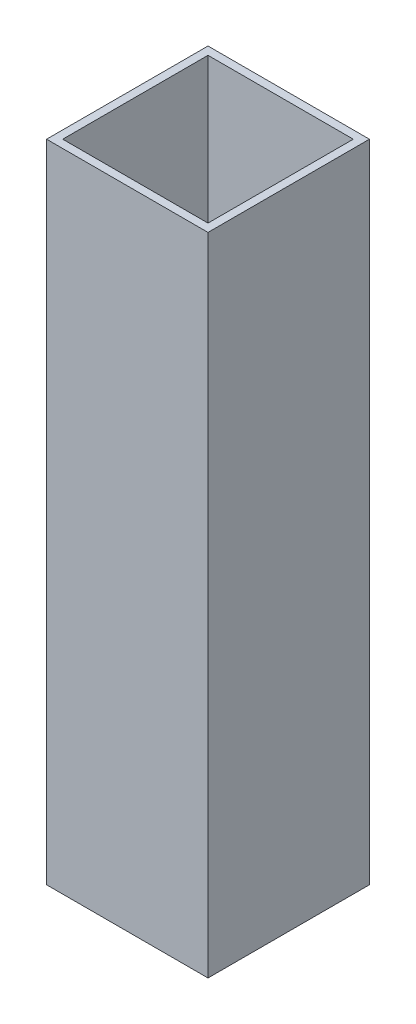
ISO-10303-21;
HEADER;
FILE_DESCRIPTION(('STEP AP214'),'2;1');
FILE_NAME('part.step','',(''),(''),'','','');
FILE_SCHEMA(('AUTOMOTIVE_DESIGN { 1 0 10303 214 1 1 1 1 }'));
ENDSEC;
DATA;
#1=APPLICATION_CONTEXT('core data for automotive mechanical design processes');
#2=APPLICATION_PROTOCOL_DEFINITION('international standard','automotive_design',2000,#1);
#3=PRODUCT_CONTEXT('',#1,'mechanical');
#4=PRODUCT('Part','Part','',(#3));
#5=PRODUCT_RELATED_PRODUCT_CATEGORY('part','',(#4));
#6=PRODUCT_DEFINITION_FORMATION('','',#4);
#7=PRODUCT_DEFINITION_CONTEXT('part definition',#1,'design');
#8=PRODUCT_DEFINITION('design','',#6,#7);
#9=PRODUCT_DEFINITION_SHAPE('','',#8);
#10=(LENGTH_UNIT() NAMED_UNIT(*) SI_UNIT(.MILLI.,.METRE.));
#11=(NAMED_UNIT(*) PLANE_ANGLE_UNIT() SI_UNIT($,.RADIAN.));
#12=(NAMED_UNIT(*) SI_UNIT($,.STERADIAN.) SOLID_ANGLE_UNIT());
#13=UNCERTAINTY_MEASURE_WITH_UNIT(LENGTH_MEASURE(1.E-05),#10,'distance_accuracy_value','');
#14=(GEOMETRIC_REPRESENTATION_CONTEXT(3) GLOBAL_UNCERTAINTY_ASSIGNED_CONTEXT((#13)) GLOBAL_UNIT_ASSIGNED_CONTEXT((#10,
#11,#12)) REPRESENTATION_CONTEXT('',''));
#15=CARTESIAN_POINT('',(0.,0.,0.));
#16=DIRECTION('',(0.,0.,1.));
#17=DIRECTION('',(1.,0.,0.));
#18=AXIS2_PLACEMENT_3D('',#15,#16,#17);
#19=CARTESIAN_POINT('',(0.,100.,0.));
#20=DIRECTION('',(0.,1.,0.));
#21=DIRECTION('',(0.,0.,1.));
#22=AXIS2_PLACEMENT_3D('',#19,#20,#21);
#23=PLANE('',#22);
#24=DIRECTION('',(0.,0.,-1.));
#25=VECTOR('',#24,1.);
#26=CARTESIAN_POINT('',(12.5,100.,-12.5));
#27=LINE('',#26,#25);
#28=CARTESIAN_POINT('',(12.5,100.,12.5));
#29=VERTEX_POINT('',#28);
#30=CARTESIAN_POINT('',(12.5,100.,-12.5));
#31=VERTEX_POINT('',#30);
#32=EDGE_CURVE('E133',#29,#31,#27,.T.);
#33=ORIENTED_EDGE('',*,*,#32,.T.);
#34=DIRECTION('',(-1.,0.,0.));
#35=VECTOR('',#34,1.);
#36=CARTESIAN_POINT('',(-12.5,100.,-12.5));
#37=LINE('',#36,#35);
#38=CARTESIAN_POINT('',(-12.5,100.,-12.5));
#39=VERTEX_POINT('',#38);
#40=EDGE_CURVE('E136',#31,#39,#37,.T.);
#41=ORIENTED_EDGE('',*,*,#40,.T.);
#42=DIRECTION('',(0.,0.,1.));
#43=VECTOR('',#42,1.);
#44=CARTESIAN_POINT('',(-12.5,100.,-12.5));
#45=LINE('',#44,#43);
#46=CARTESIAN_POINT('',(-12.5,100.,12.5));
#47=VERTEX_POINT('',#46);
#48=EDGE_CURVE('E139',#39,#47,#45,.T.);
#49=ORIENTED_EDGE('',*,*,#48,.T.);
#50=DIRECTION('',(1.,0.,0.));
#51=VECTOR('',#50,1.);
#52=CARTESIAN_POINT('',(-12.5,100.,12.5));
#53=LINE('',#52,#51);
#54=EDGE_CURVE('E141',#47,#29,#53,.T.);
#55=ORIENTED_EDGE('',*,*,#54,.T.);
#56=EDGE_LOOP('',(#33,#41,#49,#55));
#57=FACE_BOUND('',#56,.T.);
#58=DIRECTION('',(1.,0.,0.));
#59=VECTOR('',#58,1.);
#60=CARTESIAN_POINT('',(11.2504266533904,100.,11.2504266533904));
#61=LINE('',#60,#59);
#62=CARTESIAN_POINT('',(-11.2504266533904,100.,11.2504266533904));
#63=VERTEX_POINT('',#62);
#64=CARTESIAN_POINT('',(11.2504266533904,100.,11.2504266533904));
#65=VERTEX_POINT('',#64);
#66=EDGE_CURVE('E105',#63,#65,#61,.T.);
#67=ORIENTED_EDGE('',*,*,#66,.F.);
#68=DIRECTION('',(0.,0.,1.));
#69=VECTOR('',#68,1.);
#70=CARTESIAN_POINT('',(-11.2504266533904,100.,-11.2504266533904));
#71=LINE('',#70,#69);
#72=CARTESIAN_POINT('',(-11.2504266533904,100.,-11.2504266533904));
#73=VERTEX_POINT('',#72);
#74=EDGE_CURVE('E97',#73,#63,#71,.T.);
#75=ORIENTED_EDGE('',*,*,#74,.F.);
#76=DIRECTION('',(-1.,0.,0.));
#77=VECTOR('',#76,1.);
#78=CARTESIAN_POINT('',(11.2504266533904,100.,-11.2504266533904));
#79=LINE('',#78,#77);
#80=CARTESIAN_POINT('',(11.2504266533904,100.,-11.2504266533904));
#81=VERTEX_POINT('',#80);
#82=EDGE_CURVE('E119',#81,#73,#79,.T.);
#83=ORIENTED_EDGE('',*,*,#82,.F.);
#84=DIRECTION('',(0.,0.,-1.));
#85=VECTOR('',#84,1.);
#86=CARTESIAN_POINT('',(11.2504266533904,100.,-11.2504266533904));
#87=LINE('',#86,#85);
#88=EDGE_CURVE('E117',#65,#81,#87,.T.);
#89=ORIENTED_EDGE('',*,*,#88,.F.);
#90=EDGE_LOOP('',(#67,#75,#83,#89));
#91=FACE_BOUND('',#90,.T.);
#92=ADVANCED_FACE('F32',(#57,#91),#23,.T.);
#93=CARTESIAN_POINT('',(0.,0.,0.));
#94=DIRECTION('',(0.,1.,0.));
#95=DIRECTION('',(0.,0.,1.));
#96=AXIS2_PLACEMENT_3D('',#93,#94,#95);
#97=PLANE('',#96);
#98=DIRECTION('',(0.,0.,-1.));
#99=VECTOR('',#98,1.);
#100=CARTESIAN_POINT('',(12.5,0.,-12.5));
#101=LINE('',#100,#99);
#102=CARTESIAN_POINT('',(12.5,0.,12.5));
#103=VERTEX_POINT('',#102);
#104=CARTESIAN_POINT('',(12.5,0.,-12.5));
#105=VERTEX_POINT('',#104);
#106=EDGE_CURVE('E113',#103,#105,#101,.T.);
#107=ORIENTED_EDGE('',*,*,#106,.F.);
#108=DIRECTION('',(1.,0.,0.));
#109=VECTOR('',#108,1.);
#110=CARTESIAN_POINT('',(-12.5,0.,12.5));
#111=LINE('',#110,#109);
#112=CARTESIAN_POINT('',(-12.5,0.,12.5));
#113=VERTEX_POINT('',#112);
#114=EDGE_CURVE('E137',#113,#103,#111,.T.);
#115=ORIENTED_EDGE('',*,*,#114,.F.);
#116=DIRECTION('',(0.,0.,1.));
#117=VECTOR('',#116,1.);
#118=CARTESIAN_POINT('',(-12.5,0.,-12.5));
#119=LINE('',#118,#117);
#120=CARTESIAN_POINT('',(-12.5,0.,-12.5));
#121=VERTEX_POINT('',#120);
#122=EDGE_CURVE('E148',#121,#113,#119,.T.);
#123=ORIENTED_EDGE('',*,*,#122,.F.);
#124=DIRECTION('',(-1.,0.,0.));
#125=VECTOR('',#124,1.);
#126=CARTESIAN_POINT('',(-12.5,0.,-12.5));
#127=LINE('',#126,#125);
#128=EDGE_CURVE('E146',#105,#121,#127,.T.);
#129=ORIENTED_EDGE('',*,*,#128,.F.);
#130=EDGE_LOOP('',(#107,#115,#123,#129));
#131=FACE_BOUND('',#130,.T.);
#132=DIRECTION('',(0.,0.,1.));
#133=VECTOR('',#132,1.);
#134=CARTESIAN_POINT('',(-11.2504266533904,0.,-11.2504266533904));
#135=LINE('',#134,#133);
#136=CARTESIAN_POINT('',(-11.2504266533904,0.,-11.2504266533904));
#137=VERTEX_POINT('',#136);
#138=CARTESIAN_POINT('',(-11.2504266533904,0.,11.2504266533904));
#139=VERTEX_POINT('',#138);
#140=EDGE_CURVE('E55',#137,#139,#135,.T.);
#141=ORIENTED_EDGE('',*,*,#140,.T.);
#142=DIRECTION('',(1.,0.,0.));
#143=VECTOR('',#142,1.);
#144=CARTESIAN_POINT('',(11.2504266533904,0.,11.2504266533904));
#145=LINE('',#144,#143);
#146=CARTESIAN_POINT('',(11.2504266533904,0.,11.2504266533904));
#147=VERTEX_POINT('',#146);
#148=EDGE_CURVE('E112',#139,#147,#145,.T.);
#149=ORIENTED_EDGE('',*,*,#148,.T.);
#150=DIRECTION('',(0.,0.,-1.));
#151=VECTOR('',#150,1.);
#152=CARTESIAN_POINT('',(11.2504266533904,0.,-11.2504266533904));
#153=LINE('',#152,#151);
#154=CARTESIAN_POINT('',(11.2504266533904,0.,-11.2504266533904));
#155=VERTEX_POINT('',#154);
#156=EDGE_CURVE('E125',#147,#155,#153,.T.);
#157=ORIENTED_EDGE('',*,*,#156,.T.);
#158=DIRECTION('',(-1.,0.,0.));
#159=VECTOR('',#158,1.);
#160=CARTESIAN_POINT('',(11.2504266533904,0.,-11.2504266533904));
#161=LINE('',#160,#159);
#162=EDGE_CURVE('E106',#155,#137,#161,.T.);
#163=ORIENTED_EDGE('',*,*,#162,.T.);
#164=EDGE_LOOP('',(#141,#149,#157,#163));
#165=FACE_BOUND('',#164,.T.);
#166=ADVANCED_FACE('F166',(#131,#165),#97,.F.);
#167=CARTESIAN_POINT('',(12.5,100.,-12.5));
#168=DIRECTION('',(-1.,0.,0.));
#169=DIRECTION('',(0.,0.,1.));
#170=AXIS2_PLACEMENT_3D('',#167,#168,#169);
#171=PLANE('',#170);
#172=ORIENTED_EDGE('',*,*,#106,.T.);
#173=DIRECTION('',(0.,-1.,0.));
#174=VECTOR('',#173,1.);
#175=CARTESIAN_POINT('',(12.5,100.,-12.5));
#176=LINE('',#175,#174);
#177=EDGE_CURVE('E11',#31,#105,#176,.T.);
#178=ORIENTED_EDGE('',*,*,#177,.F.);
#179=ORIENTED_EDGE('',*,*,#32,.F.);
#180=DIRECTION('',(0.,-1.,0.));
#181=VECTOR('',#180,1.);
#182=CARTESIAN_POINT('',(12.5,100.,12.5));
#183=LINE('',#182,#181);
#184=EDGE_CURVE('E143',#29,#103,#183,.T.);
#185=ORIENTED_EDGE('',*,*,#184,.T.);
#186=EDGE_LOOP('',(#172,#178,#179,#185));
#187=FACE_BOUND('',#186,.T.);
#188=ADVANCED_FACE('F34',(#187),#171,.F.);
#189=CARTESIAN_POINT('',(-12.5,100.,-12.5));
#190=DIRECTION('',(0.,0.,1.));
#191=DIRECTION('',(1.,0.,0.));
#192=AXIS2_PLACEMENT_3D('',#189,#190,#191);
#193=PLANE('',#192);
#194=ORIENTED_EDGE('',*,*,#128,.T.);
#195=DIRECTION('',(0.,-1.,0.));
#196=VECTOR('',#195,1.);
#197=CARTESIAN_POINT('',(-12.5,100.,-12.5));
#198=LINE('',#197,#196);
#199=EDGE_CURVE('E40',#39,#121,#198,.T.);
#200=ORIENTED_EDGE('',*,*,#199,.F.);
#201=ORIENTED_EDGE('',*,*,#40,.F.);
#202=ORIENTED_EDGE('',*,*,#177,.T.);
#203=EDGE_LOOP('',(#194,#200,#201,#202));
#204=FACE_BOUND('',#203,.T.);
#205=ADVANCED_FACE('F176',(#204),#193,.F.);
#206=CARTESIAN_POINT('',(-12.5,100.,-12.5));
#207=DIRECTION('',(1.,0.,0.));
#208=DIRECTION('',(0.,0.,-1.));
#209=AXIS2_PLACEMENT_3D('',#206,#207,#208);
#210=PLANE('',#209);
#211=ORIENTED_EDGE('',*,*,#122,.T.);
#212=DIRECTION('',(0.,-1.,0.));
#213=VECTOR('',#212,1.);
#214=CARTESIAN_POINT('',(-12.5,100.,12.5));
#215=LINE('',#214,#213);
#216=EDGE_CURVE('E153',#47,#113,#215,.T.);
#217=ORIENTED_EDGE('',*,*,#216,.F.);
#218=ORIENTED_EDGE('',*,*,#48,.F.);
#219=ORIENTED_EDGE('',*,*,#199,.T.);
#220=EDGE_LOOP('',(#211,#217,#218,#219));
#221=FACE_BOUND('',#220,.T.);
#222=ADVANCED_FACE('F160',(#221),#210,.F.);
#223=CARTESIAN_POINT('',(-12.5,100.,12.5));
#224=DIRECTION('',(0.,0.,-1.));
#225=DIRECTION('',(-1.,0.,0.));
#226=AXIS2_PLACEMENT_3D('',#223,#224,#225);
#227=PLANE('',#226);
#228=ORIENTED_EDGE('',*,*,#114,.T.);
#229=ORIENTED_EDGE('',*,*,#184,.F.);
#230=ORIENTED_EDGE('',*,*,#54,.F.);
#231=ORIENTED_EDGE('',*,*,#216,.T.);
#232=EDGE_LOOP('',(#228,#229,#230,#231));
#233=FACE_BOUND('',#232,.T.);
#234=ADVANCED_FACE('F170',(#233),#227,.F.);
#235=CARTESIAN_POINT('',(-11.2504266533904,100.,-11.2504266533904));
#236=DIRECTION('',(1.,0.,0.));
#237=DIRECTION('',(0.,0.,-1.));
#238=AXIS2_PLACEMENT_3D('',#235,#236,#237);
#239=PLANE('',#238);
#240=ORIENTED_EDGE('',*,*,#140,.F.);
#241=DIRECTION('',(0.,-1.,0.));
#242=VECTOR('',#241,1.);
#243=CARTESIAN_POINT('',(-11.2504266533904,100.,-11.2504266533904));
#244=LINE('',#243,#242);
#245=EDGE_CURVE('E101',#73,#137,#244,.T.);
#246=ORIENTED_EDGE('',*,*,#245,.F.);
#247=ORIENTED_EDGE('',*,*,#74,.T.);
#248=DIRECTION('',(0.,-1.,0.));
#249=VECTOR('',#248,1.);
#250=CARTESIAN_POINT('',(-11.2504266533904,100.,11.2504266533904));
#251=LINE('',#250,#249);
#252=EDGE_CURVE('E100',#63,#139,#251,.T.);
#253=ORIENTED_EDGE('',*,*,#252,.T.);
#254=EDGE_LOOP('',(#240,#246,#247,#253));
#255=FACE_BOUND('',#254,.T.);
#256=ADVANCED_FACE('F99',(#255),#239,.T.);
#257=CARTESIAN_POINT('',(11.2504266533904,100.,11.2504266533904));
#258=DIRECTION('',(0.,0.,-1.));
#259=DIRECTION('',(-1.,0.,0.));
#260=AXIS2_PLACEMENT_3D('',#257,#258,#259);
#261=PLANE('',#260);
#262=ORIENTED_EDGE('',*,*,#148,.F.);
#263=ORIENTED_EDGE('',*,*,#252,.F.);
#264=ORIENTED_EDGE('',*,*,#66,.T.);
#265=DIRECTION('',(0.,-1.,0.));
#266=VECTOR('',#265,1.);
#267=CARTESIAN_POINT('',(11.2504266533904,100.,11.2504266533904));
#268=LINE('',#267,#266);
#269=EDGE_CURVE('E114',#65,#147,#268,.T.);
#270=ORIENTED_EDGE('',*,*,#269,.T.);
#271=EDGE_LOOP('',(#262,#263,#264,#270));
#272=FACE_BOUND('',#271,.T.);
#273=ADVANCED_FACE('F109',(#272),#261,.T.);
#274=CARTESIAN_POINT('',(11.2504266533904,100.,-11.2504266533904));
#275=DIRECTION('',(-1.,0.,0.));
#276=DIRECTION('',(0.,0.,1.));
#277=AXIS2_PLACEMENT_3D('',#274,#275,#276);
#278=PLANE('',#277);
#279=ORIENTED_EDGE('',*,*,#156,.F.);
#280=ORIENTED_EDGE('',*,*,#269,.F.);
#281=ORIENTED_EDGE('',*,*,#88,.T.);
#282=DIRECTION('',(0.,-1.,0.));
#283=VECTOR('',#282,1.);
#284=CARTESIAN_POINT('',(11.2504266533904,100.,-11.2504266533904));
#285=LINE('',#284,#283);
#286=EDGE_CURVE('E47',#81,#155,#285,.T.);
#287=ORIENTED_EDGE('',*,*,#286,.T.);
#288=EDGE_LOOP('',(#279,#280,#281,#287));
#289=FACE_BOUND('',#288,.T.);
#290=ADVANCED_FACE('F199',(#289),#278,.T.);
#291=CARTESIAN_POINT('',(11.2504266533904,100.,-11.2504266533904));
#292=DIRECTION('',(0.,0.,1.));
#293=DIRECTION('',(1.,0.,0.));
#294=AXIS2_PLACEMENT_3D('',#291,#292,#293);
#295=PLANE('',#294);
#296=ORIENTED_EDGE('',*,*,#162,.F.);
#297=ORIENTED_EDGE('',*,*,#286,.F.);
#298=ORIENTED_EDGE('',*,*,#82,.T.);
#299=ORIENTED_EDGE('',*,*,#245,.T.);
#300=EDGE_LOOP('',(#296,#297,#298,#299));
#301=FACE_BOUND('',#300,.T.);
#302=ADVANCED_FACE('F203',(#301),#295,.T.);
#303=CLOSED_SHELL('',(#92,#166,#188,#205,#222,#234,#256,#273,#290,#302));
#304=MANIFOLD_SOLID_BREP('B2',#303);
#305=ADVANCED_BREP_SHAPE_REPRESENTATION('',(#18,#304),#14);
#306=SHAPE_DEFINITION_REPRESENTATION(#9,#305);
ENDSEC;
END-ISO-10303-21;
